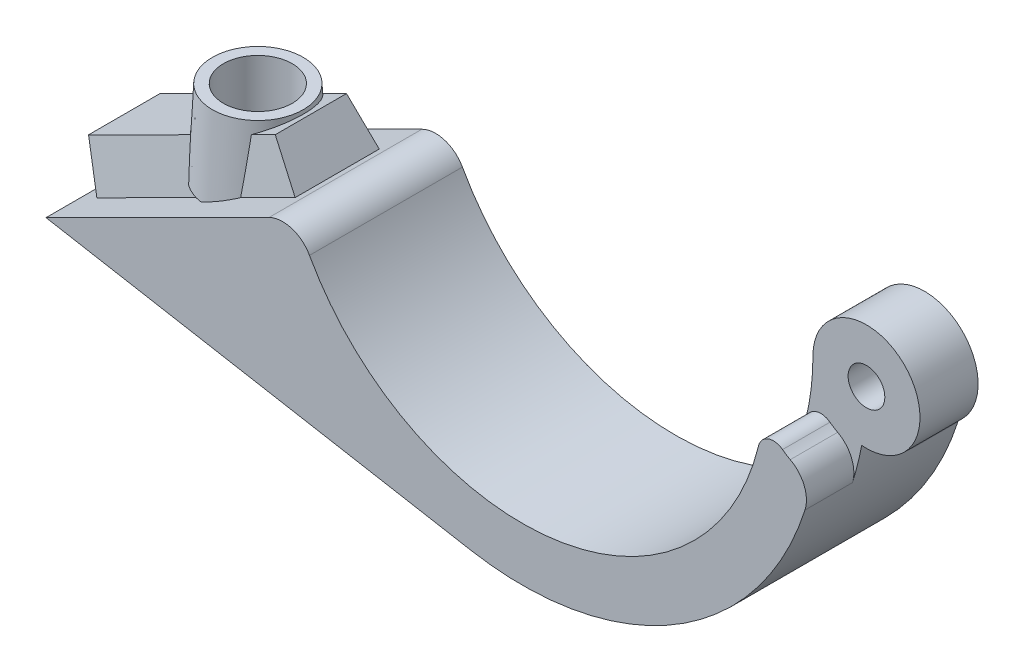
ISO-10303-21;
HEADER;
FILE_DESCRIPTION(('STEP AP214'),'2;1');
FILE_NAME('part.step','',(''),(''),'','','');
FILE_SCHEMA(('AUTOMOTIVE_DESIGN { 1 0 10303 214 1 1 1 1 }'));
ENDSEC;
DATA;
#1=APPLICATION_CONTEXT('core data for automotive mechanical design processes');
#2=APPLICATION_PROTOCOL_DEFINITION('international standard','automotive_design',2000,#1);
#3=PRODUCT_CONTEXT('',#1,'mechanical');
#4=PRODUCT('Part','Part','',(#3));
#5=PRODUCT_RELATED_PRODUCT_CATEGORY('part','',(#4));
#6=PRODUCT_DEFINITION_FORMATION('','',#4);
#7=PRODUCT_DEFINITION_CONTEXT('part definition',#1,'design');
#8=PRODUCT_DEFINITION('design','',#6,#7);
#9=PRODUCT_DEFINITION_SHAPE('','',#8);
#10=(LENGTH_UNIT() NAMED_UNIT(*) SI_UNIT(.MILLI.,.METRE.));
#11=(NAMED_UNIT(*) PLANE_ANGLE_UNIT() SI_UNIT($,.RADIAN.));
#12=(NAMED_UNIT(*) SI_UNIT($,.STERADIAN.) SOLID_ANGLE_UNIT());
#13=UNCERTAINTY_MEASURE_WITH_UNIT(LENGTH_MEASURE(1.E-05),#10,'distance_accuracy_value','');
#14=(GEOMETRIC_REPRESENTATION_CONTEXT(3) GLOBAL_UNCERTAINTY_ASSIGNED_CONTEXT((#13)) GLOBAL_UNIT_ASSIGNED_CONTEXT((#10,
#11,#12)) REPRESENTATION_CONTEXT('',''));
#15=CARTESIAN_POINT('',(0.,0.,0.));
#16=DIRECTION('',(0.,0.,1.));
#17=DIRECTION('',(1.,0.,0.));
#18=AXIS2_PLACEMENT_3D('',#15,#16,#17);
#19=CARTESIAN_POINT('',(-32.8,-13.865042807226,10.));
#20=DIRECTION('',(0.175293950205598,0.984516140559065,0.));
#21=DIRECTION('',(-0.984516140559065,0.175293950205598,0.));
#22=AXIS2_PLACEMENT_3D('',#19,#20,#21);
#23=PLANE('',#22);
#24=DIRECTION('',(0.,0.,1.));
#25=VECTOR('',#24,1.);
#26=CARTESIAN_POINT('',(-31.152278781714,-14.1584209950401,10.));
#27=LINE('',#26,#25);
#28=CARTESIAN_POINT('',(-31.152278781714,-14.1584209950401,0.));
#29=VERTEX_POINT('',#28);
#30=CARTESIAN_POINT('',(-31.152278781714,-14.1584209950401,10.));
#31=VERTEX_POINT('',#30);
#32=EDGE_CURVE('E322',#29,#31,#27,.T.);
#33=ORIENTED_EDGE('',*,*,#32,.F.);
#34=DIRECTION('',(0.984516140559066,-0.175293950205598,0.));
#35=VECTOR('',#34,1.);
#36=CARTESIAN_POINT('',(-32.8,-13.865042807226,0.));
#37=LINE('',#36,#35);
#38=CARTESIAN_POINT('',(-3.4007026339886,-19.0996131268459,0.));
#39=VERTEX_POINT('',#38);
#40=EDGE_CURVE('E368',#29,#39,#37,.T.);
#41=ORIENTED_EDGE('',*,*,#40,.T.);
#42=DIRECTION('',(0.,0.,-1.));
#43=VECTOR('',#42,1.);
#44=CARTESIAN_POINT('',(-3.4007026339886,-19.0996131268459,10.));
#45=LINE('',#44,#43);
#46=CARTESIAN_POINT('',(-3.4007026339886,-19.0996131268459,10.));
#47=VERTEX_POINT('',#46);
#48=EDGE_CURVE('E374',#47,#39,#45,.T.);
#49=ORIENTED_EDGE('',*,*,#48,.F.);
#50=DIRECTION('',(0.984516140559066,-0.175293950205598,0.));
#51=VECTOR('',#50,1.);
#52=CARTESIAN_POINT('',(-32.8,-13.865042807226,10.));
#53=LINE('',#52,#51);
#54=EDGE_CURVE('E360',#31,#47,#53,.T.);
#55=ORIENTED_EDGE('',*,*,#54,.F.);
#56=EDGE_LOOP('',(#33,#41,#49,#55));
#57=FACE_BOUND('',#56,.T.);
#58=DIRECTION('',(-0.498030318468977,0.0886747288845909,0.862613815297978));
#59=VECTOR('',#58,1.);
#60=CARTESIAN_POINT('',(-24.72915805951,-15.3020631941443,14.8074251786868));
#61=LINE('',#60,#59);
#62=CARTESIAN_POINT('',(-19.0668384925381,-16.3102440896422,5.));
#63=VERTEX_POINT('',#62);
#64=CARTESIAN_POINT('',(-20.683419246269,-16.0224104884715,7.80000000000001));
#65=VERTEX_POINT('',#64);
#66=EDGE_CURVE('E11',#63,#65,#61,.T.);
#67=ORIENTED_EDGE('',*,*,#66,.F.);
#68=DIRECTION('',(0.498030318468978,-0.088674728884591,0.862613815297977));
#69=VECTOR('',#68,1.);
#70=CARTESIAN_POINT('',(-20.4330797280241,-16.0669836561808,2.6336007647425));
#71=LINE('',#70,#69);
#72=CARTESIAN_POINT('',(-20.6834192462691,-16.0224104884715,2.19999999999999));
#73=VERTEX_POINT('',#72);
#74=EDGE_CURVE('E41',#73,#63,#71,.T.);
#75=ORIENTED_EDGE('',*,*,#74,.F.);
#76=DIRECTION('',(0.984516140559065,-0.175293950205598,0.));
#77=VECTOR('',#76,1.);
#78=CARTESIAN_POINT('',(-32.8,-13.865042807226,2.19999999999999));
#79=LINE('',#78,#77);
#80=CARTESIAN_POINT('',(-23.916580753731,-15.44674328613,2.19999999999999));
#81=VERTEX_POINT('',#80);
#82=EDGE_CURVE('E444',#81,#73,#79,.T.);
#83=ORIENTED_EDGE('',*,*,#82,.F.);
#84=DIRECTION('',(0.498030318468977,-0.0886747288845909,-0.862613815297978));
#85=VECTOR('',#84,1.);
#86=CARTESIAN_POINT('',(-29.5407657907743,-14.4453522766634,11.9413742353277));
#87=LINE('',#86,#85);
#88=CARTESIAN_POINT('',(-25.5331615074619,-15.1589096849592,4.99999999999999));
#89=VERTEX_POINT('',#88);
#90=EDGE_CURVE('E442',#89,#81,#87,.T.);
#91=ORIENTED_EDGE('',*,*,#90,.F.);
#92=DIRECTION('',(-0.498030318468978,0.088674728884591,-0.862613815297977));
#93=VECTOR('',#92,1.);
#94=CARTESIAN_POINT('',(-25.2446874592884,-15.2102727386999,5.49965170810165));
#95=LINE('',#94,#93);
#96=CARTESIAN_POINT('',(-23.9165807537309,-15.44674328613,7.80000000000001));
#97=VERTEX_POINT('',#96);
#98=EDGE_CURVE('E440',#97,#89,#95,.T.);
#99=ORIENTED_EDGE('',*,*,#98,.F.);
#100=DIRECTION('',(-0.984516140559065,0.175293950205598,0.));
#101=VECTOR('',#100,1.);
#102=CARTESIAN_POINT('',(-32.8,-13.865042807226,7.80000000000001));
#103=LINE('',#102,#101);
#104=EDGE_CURVE('E437',#65,#97,#103,.T.);
#105=ORIENTED_EDGE('',*,*,#104,.F.);
#106=EDGE_LOOP('',(#67,#75,#83,#91,#99,#105));
#107=FACE_BOUND('',#106,.T.);
#108=ADVANCED_FACE('F33',(#57,#107),#23,.F.);
#109=CARTESIAN_POINT('',(-0.575799802144668,1.15007573002816,0.));
#110=DIRECTION('',(-0.447687460912666,0.894190101343987,0.));
#111=DIRECTION('',(-0.894190101343987,-0.447687460912666,0.));
#112=AXIS2_PLACEMENT_3D('',#109,#110,#111);
#113=PLANE('',#112);
#114=DIRECTION('',(0.894190101343987,0.447687460912666,0.));
#115=VECTOR('',#114,1.);
#116=CARTESIAN_POINT('',(-32.3523125390873,-14.75923290857,10.));
#117=LINE('',#116,#115);
#118=CARTESIAN_POINT('',(-16.5690700582178,-6.8571551058644,10.));
#119=VERTEX_POINT('',#118);
#120=EDGE_CURVE('E299',#31,#119,#117,.T.);
#121=ORIENTED_EDGE('',*,*,#120,.T.);
#122=DIRECTION('',(0.,0.,1.));
#123=VECTOR('',#122,1.);
#124=CARTESIAN_POINT('',(-16.5690700582178,-6.8571551058644,0.));
#125=LINE('',#124,#123);
#126=CARTESIAN_POINT('',(-16.5690700582178,-6.8571551058644,0.));
#127=VERTEX_POINT('',#126);
#128=EDGE_CURVE('E408',#119,#127,#125,.F.);
#129=ORIENTED_EDGE('',*,*,#128,.T.);
#130=DIRECTION('',(-0.894190101343987,-0.447687460912666,0.));
#131=VECTOR('',#130,1.);
#132=CARTESIAN_POINT('',(-0.575799802144668,1.15007573002816,0.));
#133=LINE('',#132,#131);
#134=EDGE_CURVE('E377',#127,#29,#133,.T.);
#135=ORIENTED_EDGE('',*,*,#134,.T.);
#136=ORIENTED_EDGE('',*,*,#32,.T.);
#137=EDGE_LOOP('',(#121,#129,#135,#136));
#138=FACE_BOUND('',#137,.T.);
#139=DIRECTION('',(0.894190101343987,0.447687460912666,0.));
#140=VECTOR('',#139,1.);
#141=CARTESIAN_POINT('',(-30.0763550695001,-13.6197463282855,7.75));
#142=LINE('',#141,#140);
#143=CARTESIAN_POINT('',(-20.6772605160455,-8.9139720536769,7.75));
#144=VERTEX_POINT('',#143);
#145=CARTESIAN_POINT('',(-17.1105986000123,-7.12827814505184,7.75));
#146=VERTEX_POINT('',#145);
#147=EDGE_CURVE('E285',#144,#146,#142,.T.);
#148=ORIENTED_EDGE('',*,*,#147,.F.);
#149=CARTESIAN_POINT('',(-22.3849577678789,-9.76895204678102,5.));
#150=DIRECTION('',(-0.447687460912666,0.894190101343987,0.));
#151=DIRECTION('',(-0.894190101343987,-0.447687460912666,0.));
#152=AXIS2_PLACEMENT_3D('',#149,#150,#151);
#153=ELLIPSE('',#152,3.62103235653949,3.23677651107604);
#154=CARTESIAN_POINT('',(-22.8464421978494,-10.,8.20373234281667));
#155=VERTEX_POINT('',#154);
#156=EDGE_CURVE('E272',#144,#155,#153,.F.);
#157=ORIENTED_EDGE('',*,*,#156,.T.);
#158=DIRECTION('',(0.,0.,-1.));
#159=VECTOR('',#158,1.);
#160=CARTESIAN_POINT('',(-22.8464421978494,-10.,0.));
#161=LINE('',#160,#159);
#162=CARTESIAN_POINT('',(-22.8464421978494,-10.,7.75));
#163=VERTEX_POINT('',#162);
#164=EDGE_CURVE('E280',#155,#163,#161,.T.);
#165=ORIENTED_EDGE('',*,*,#164,.T.);
#166=CARTESIAN_POINT('',(-30.0763550695001,-13.6197463282855,7.75));
#167=VERTEX_POINT('',#166);
#168=EDGE_CURVE('E286',#167,#163,#142,.T.);
#169=ORIENTED_EDGE('',*,*,#168,.F.);
#170=DIRECTION('',(0.,0.,1.));
#171=VECTOR('',#170,1.);
#172=CARTESIAN_POINT('',(-30.0763550695001,-13.6197463282855,2.25));
#173=LINE('',#172,#171);
#174=CARTESIAN_POINT('',(-30.0763550695001,-13.6197463282855,2.25));
#175=VERTEX_POINT('',#174);
#176=EDGE_CURVE('E282',#175,#167,#173,.T.);
#177=ORIENTED_EDGE('',*,*,#176,.F.);
#178=DIRECTION('',(-0.894190101343987,-0.447687460912666,0.));
#179=VECTOR('',#178,1.);
#180=CARTESIAN_POINT('',(-30.0763550695001,-13.6197463282855,2.25));
#181=LINE('',#180,#179);
#182=CARTESIAN_POINT('',(-22.8464421978494,-10.,2.25));
#183=VERTEX_POINT('',#182);
#184=EDGE_CURVE('E292',#183,#175,#181,.T.);
#185=ORIENTED_EDGE('',*,*,#184,.F.);
#186=CARTESIAN_POINT('',(-22.8464421978494,-10.,1.79626765718333));
#187=VERTEX_POINT('',#186);
#188=EDGE_CURVE('E276',#183,#187,#161,.T.);
#189=ORIENTED_EDGE('',*,*,#188,.T.);
#190=CARTESIAN_POINT('',(-20.6772605160454,-8.91397205367689,2.25));
#191=VERTEX_POINT('',#190);
#192=EDGE_CURVE('E275',#187,#191,#153,.F.);
#193=ORIENTED_EDGE('',*,*,#192,.T.);
#194=CARTESIAN_POINT('',(-17.1105986000123,-7.12827814505184,2.25));
#195=VERTEX_POINT('',#194);
#196=EDGE_CURVE('E293',#195,#191,#181,.T.);
#197=ORIENTED_EDGE('',*,*,#196,.F.);
#198=DIRECTION('',(0.,0.,-1.));
#199=VECTOR('',#198,1.);
#200=CARTESIAN_POINT('',(-17.1105986000123,-7.12827814505184,2.25));
#201=LINE('',#200,#199);
#202=EDGE_CURVE('E289',#146,#195,#201,.T.);
#203=ORIENTED_EDGE('',*,*,#202,.F.);
#204=EDGE_LOOP('',(#148,#157,#165,#169,#177,#185,#189,#193,#197,#203));
#205=FACE_BOUND('',#204,.T.);
#206=ADVANCED_FACE('F485',(#138,#205),#113,.T.);
#207=CARTESIAN_POINT('',(-30.0763550695001,-13.6197463282855,7.75));
#208=DIRECTION('',(-0.0623060521961539,0.124447209251838,0.99026806874157));
#209=DIRECTION('',(0.,-0.992195815435928,0.12468946960924));
#210=AXIS2_PLACEMENT_3D('',#207,#208,#209);
#211=PLANE('',#210);
#212=CARTESIAN_POINT('',(-22.3664020046807,3.72509544041,6.0553675384334));
#213=DIRECTION('',(-0.0623060521961539,0.124447209251838,0.99026806874157));
#214=DIRECTION('',(-0.00781456292776182,-0.992226230307095,0.124201612295569));
#215=AXIS2_PLACEMENT_3D('',#212,#213,#214);
#216=ELLIPSE('',#215,20.3355161014419,2.29917890808214);
#217=CARTESIAN_POINT('',(-20.3927759697885,-5.4165500183824,7.32837749589283));
#218=VERTEX_POINT('',#217);
#219=EDGE_CURVE('E271',#144,#218,#216,.T.);
#220=ORIENTED_EDGE('',*,*,#219,.F.);
#221=ORIENTED_EDGE('',*,*,#147,.T.);
#222=DIRECTION('',(0.562357730083639,-0.815323657757394,0.137844537491629));
#223=VECTOR('',#222,1.);
#224=CARTESIAN_POINT('',(-17.5369472766575,-6.51014462624931,7.64549385916045));
#225=LINE('',#224,#223);
#226=CARTESIAN_POINT('',(-18.8306716524268,-4.63446294934726,7.32837749589283));
#227=VERTEX_POINT('',#226);
#228=EDGE_CURVE('E300',#227,#146,#225,.T.);
#229=ORIENTED_EDGE('',*,*,#228,.F.);
#230=DIRECTION('',(-0.894190101343987,-0.447687460912666,0.));
#231=VECTOR('',#230,1.);
#232=CARTESIAN_POINT('',(-31.4194174522381,-10.9371760242535,7.32837749589283));
#233=LINE('',#232,#231);
#234=EDGE_CURVE('E311',#218,#227,#233,.F.);
#235=ORIENTED_EDGE('',*,*,#234,.F.);
#236=EDGE_LOOP('',(#220,#221,#229,#235));
#237=FACE_BOUND('',#236,.T.);
#238=ADVANCED_FACE('F491',(#237),#211,.T.);
#239=CARTESIAN_POINT('',(-24.3679062631469,-7.40674873021766,7.32837749589283));
#240=VERTEX_POINT('',#239);
#241=CARTESIAN_POINT('',(-24.1564882875183,-10.,7.66757403614356));
#242=VERTEX_POINT('',#241);
#243=EDGE_CURVE('E268',#240,#242,#216,.T.);
#244=ORIENTED_EDGE('',*,*,#243,.F.);
#245=CARTESIAN_POINT('',(-31.0424067825616,-10.7484209159262,7.32837749589283));
#246=VERTEX_POINT('',#245);
#247=EDGE_CURVE('E312',#246,#240,#233,.F.);
#248=ORIENTED_EDGE('',*,*,#247,.F.);
#249=DIRECTION('',(0.31583928818493,-0.93874619973801,0.137844537491629));
#250=VECTOR('',#249,1.);
#251=CARTESIAN_POINT('',(-30.0763550695001,-13.6197463282855,7.75));
#252=LINE('',#251,#250);
#253=EDGE_CURVE('E297',#246,#167,#252,.T.);
#254=ORIENTED_EDGE('',*,*,#253,.T.);
#255=ORIENTED_EDGE('',*,*,#168,.T.);
#256=DIRECTION('',(-0.998026496875698,0.,-0.0627941998437897));
#257=VECTOR('',#256,1.);
#258=CARTESIAN_POINT('',(-30.047846716666,-10.,7.29689936998049));
#259=LINE('',#258,#257);
#260=EDGE_CURVE('E279',#242,#163,#259,.F.);
#261=ORIENTED_EDGE('',*,*,#260,.F.);
#262=EDGE_LOOP('',(#244,#248,#254,#255,#261));
#263=FACE_BOUND('',#262,.T.);
#264=ADVANCED_FACE('F736',(#263),#211,.T.);
#265=CARTESIAN_POINT('',(-30.0763550695001,-13.6197463282855,2.25));
#266=DIRECTION('',(-0.0623060521961539,0.124447209251838,-0.99026806874157));
#267=DIRECTION('',(0.,0.992195815435928,0.12468946960924));
#268=AXIS2_PLACEMENT_3D('',#265,#266,#267);
#269=PLANE('',#268);
#270=CARTESIAN_POINT('',(-22.3664020046807,3.72509544041047,3.94463246156666));
#271=DIRECTION('',(-0.0623060521961539,0.124447209251838,-0.99026806874157));
#272=DIRECTION('',(-0.00781456292776182,-0.992226230307096,-0.124201612295569));
#273=AXIS2_PLACEMENT_3D('',#270,#271,#272);
#274=ELLIPSE('',#273,20.3355161014426,2.29917890808218);
#275=CARTESIAN_POINT('',(-20.3927759697885,-5.4165500183824,2.67162250410717));
#276=VERTEX_POINT('',#275);
#277=EDGE_CURVE('E269',#276,#191,#274,.T.);
#278=ORIENTED_EDGE('',*,*,#277,.F.);
#279=DIRECTION('',(0.894190101343987,0.447687460912666,0.));
#280=VECTOR('',#279,1.);
#281=CARTESIAN_POINT('',(-31.4194174522381,-10.9371760242535,2.67162250410717));
#282=LINE('',#281,#280);
#283=CARTESIAN_POINT('',(-18.8306716524268,-4.63446294934726,2.67162250410717));
#284=VERTEX_POINT('',#283);
#285=EDGE_CURVE('E305',#284,#276,#282,.F.);
#286=ORIENTED_EDGE('',*,*,#285,.F.);
#287=DIRECTION('',(0.562357730083639,-0.815323657757394,-0.137844537491629));
#288=VECTOR('',#287,1.);
#289=CARTESIAN_POINT('',(-18.2346087475315,-5.49865341366335,2.52551618948607));
#290=LINE('',#289,#288);
#291=EDGE_CURVE('E304',#284,#195,#290,.T.);
#292=ORIENTED_EDGE('',*,*,#291,.T.);
#293=ORIENTED_EDGE('',*,*,#196,.T.);
#294=EDGE_LOOP('',(#278,#286,#292,#293));
#295=FACE_BOUND('',#294,.T.);
#296=ADVANCED_FACE('F732',(#295),#269,.T.);
#297=CARTESIAN_POINT('',(-24.1564882875183,-10.,2.33242596385644));
#298=VERTEX_POINT('',#297);
#299=CARTESIAN_POINT('',(-24.3679062631469,-7.40674873021766,2.67162250410717));
#300=VERTEX_POINT('',#299);
#301=EDGE_CURVE('E266',#298,#300,#274,.T.);
#302=ORIENTED_EDGE('',*,*,#301,.F.);
#303=DIRECTION('',(0.998026496875698,0.,-0.0627941998437897));
#304=VECTOR('',#303,1.);
#305=CARTESIAN_POINT('',(-30.047846716666,-10.,2.70310063001951));
#306=LINE('',#305,#304);
#307=EDGE_CURVE('E383',#183,#298,#306,.F.);
#308=ORIENTED_EDGE('',*,*,#307,.F.);
#309=ORIENTED_EDGE('',*,*,#184,.T.);
#310=DIRECTION('',(0.315839288184931,-0.93874619973801,-0.137844537491629));
#311=VECTOR('',#310,1.);
#312=CARTESIAN_POINT('',(-30.0763550695001,-13.6197463282855,2.25));
#313=LINE('',#312,#311);
#314=CARTESIAN_POINT('',(-31.0424067825616,-10.7484209159262,2.67162250410717));
#315=VERTEX_POINT('',#314);
#316=EDGE_CURVE('E301',#315,#175,#313,.T.);
#317=ORIENTED_EDGE('',*,*,#316,.F.);
#318=EDGE_CURVE('E317',#300,#315,#282,.F.);
#319=ORIENTED_EDGE('',*,*,#318,.F.);
#320=EDGE_LOOP('',(#302,#308,#309,#317,#319));
#321=FACE_BOUND('',#320,.T.);
#322=ADVANCED_FACE('F735',(#321),#269,.T.);
#323=CARTESIAN_POINT('',(-1.91886218488267,3.83264603406012,0.));
#324=DIRECTION('',(-0.447687460912666,0.894190101343987,0.));
#325=DIRECTION('',(-0.894190101343987,-0.447687460912666,0.));
#326=AXIS2_PLACEMENT_3D('',#323,#324,#325);
#327=PLANE('',#326);
#328=ORIENTED_EDGE('',*,*,#285,.T.);
#329=CARTESIAN_POINT('',(-22.3803411164677,-6.41164937430003,5.));
#330=DIRECTION('',(-0.447687460912666,0.894190101343987,0.));
#331=DIRECTION('',(-0.894190101343987,-0.447687460912666,0.));
#332=AXIS2_PLACEMENT_3D('',#329,#330,#331);
#333=ELLIPSE('',#332,3.42426348470643,3.06088831131721);
#334=EDGE_CURVE('E382',#276,#218,#333,.F.);
#335=ORIENTED_EDGE('',*,*,#334,.T.);
#336=ORIENTED_EDGE('',*,*,#234,.T.);
#337=DIRECTION('',(0.,0.,1.));
#338=VECTOR('',#337,1.);
#339=CARTESIAN_POINT('',(-18.8306716524268,-4.63446294934726,2.25));
#340=LINE('',#339,#338);
#341=EDGE_CURVE('E315',#227,#284,#340,.F.);
#342=ORIENTED_EDGE('',*,*,#341,.T.);
#343=EDGE_LOOP('',(#328,#335,#336,#342));
#344=FACE_BOUND('',#343,.T.);
#345=ADVANCED_FACE('F503',(#344),#327,.T.);
#346=CARTESIAN_POINT('',(0.,0.,10.));
#347=DIRECTION('',(0.,0.,-1.));
#348=DIRECTION('',(-1.,0.,0.));
#349=AXIS2_PLACEMENT_3D('',#346,#347,#348);
#350=CYLINDRICAL_SURFACE('',#349,15.9);
#351=CARTESIAN_POINT('',(0.,0.,3.1));
#352=DIRECTION('',(0.,0.,-1.));
#353=DIRECTION('',(-1.,0.,0.));
#354=AXIS2_PLACEMENT_3D('',#351,#352,#353);
#355=CIRCLE('',#354,15.9);
#356=CARTESIAN_POINT('',(15.4453470993717,-3.77508317523346,3.1));
#357=VERTEX_POINT('',#356);
#358=CARTESIAN_POINT('',(15.9,0.,3.1));
#359=VERTEX_POINT('',#358);
#360=EDGE_CURVE('E338',#357,#359,#355,.F.);
#361=ORIENTED_EDGE('',*,*,#360,.F.);
#362=DIRECTION('',(0.,0.,-1.));
#363=VECTOR('',#362,1.);
#364=CARTESIAN_POINT('',(15.4453470993717,-3.77508317523346,10.));
#365=LINE('',#364,#363);
#366=CARTESIAN_POINT('',(15.4453470993717,-3.77508317523346,0.));
#367=VERTEX_POINT('',#366);
#368=EDGE_CURVE('E425',#357,#367,#365,.T.);
#369=ORIENTED_EDGE('',*,*,#368,.T.);
#370=CARTESIAN_POINT('',(0.,0.,0.));
#371=DIRECTION('',(0.,0.,-1.));
#372=DIRECTION('',(1.,0.,0.));
#373=AXIS2_PLACEMENT_3D('',#370,#371,#372);
#374=CIRCLE('',#373,15.9);
#375=CARTESIAN_POINT('',(-13.9224442831643,-7.67955370983144,0.));
#376=VERTEX_POINT('',#375);
#377=EDGE_CURVE('E357',#367,#376,#374,.T.);
#378=ORIENTED_EDGE('',*,*,#377,.T.);
#379=DIRECTION('',(0.,0.,-1.));
#380=VECTOR('',#379,1.);
#381=CARTESIAN_POINT('',(-13.9224442831643,-7.67955370983144,10.));
#382=LINE('',#381,#380);
#383=CARTESIAN_POINT('',(-13.9224442831643,-7.67955370983144,10.));
#384=VERTEX_POINT('',#383);
#385=EDGE_CURVE('E411',#376,#384,#382,.F.);
#386=ORIENTED_EDGE('',*,*,#385,.T.);
#387=CARTESIAN_POINT('',(0.,0.,10.));
#388=DIRECTION('',(0.,0.,-1.));
#389=DIRECTION('',(1.,0.,0.));
#390=AXIS2_PLACEMENT_3D('',#387,#388,#389);
#391=CIRCLE('',#390,15.9);
#392=CARTESIAN_POINT('',(15.4453470993717,-3.77508317523346,10.));
#393=VERTEX_POINT('',#392);
#394=EDGE_CURVE('E358',#393,#384,#391,.T.);
#395=ORIENTED_EDGE('',*,*,#394,.F.);
#396=DIRECTION('',(0.,0.,-1.));
#397=VECTOR('',#396,1.);
#398=CARTESIAN_POINT('',(15.4453470993717,-3.77508317523346,10.));
#399=LINE('',#398,#397);
#400=CARTESIAN_POINT('',(15.4453470993717,-3.77508317523346,6.9));
#401=VERTEX_POINT('',#400);
#402=EDGE_CURVE('E422',#393,#401,#399,.T.);
#403=ORIENTED_EDGE('',*,*,#402,.T.);
#404=CARTESIAN_POINT('',(0.,0.,6.9));
#405=DIRECTION('',(0.,0.,1.));
#406=DIRECTION('',(1.,0.,0.));
#407=AXIS2_PLACEMENT_3D('',#404,#405,#406);
#408=CIRCLE('',#407,15.9);
#409=CARTESIAN_POINT('',(15.9,0.,6.9));
#410=VERTEX_POINT('',#409);
#411=EDGE_CURVE('E346',#410,#401,#408,.F.);
#412=ORIENTED_EDGE('',*,*,#411,.F.);
#413=DIRECTION('',(0.,0.,-1.));
#414=VECTOR('',#413,1.);
#415=CARTESIAN_POINT('',(15.9,0.,10.));
#416=LINE('',#415,#414);
#417=EDGE_CURVE('E366',#410,#359,#416,.T.);
#418=ORIENTED_EDGE('',*,*,#417,.T.);
#419=EDGE_LOOP('',(#361,#369,#378,#386,#395,#403,#412,#418));
#420=FACE_BOUND('',#419,.T.);
#421=ADVANCED_FACE('F499',(#420),#350,.F.);
#422=CARTESIAN_POINT('',(0.,0.,10.));
#423=DIRECTION('',(0.,0.,1.));
#424=DIRECTION('',(1.,0.,0.));
#425=AXIS2_PLACEMENT_3D('',#422,#423,#424);
#426=PLANE('',#425);
#427=CARTESIAN_POINT('',(19.4,0.,10.));
#428=DIRECTION('',(0.,0.,1.));
#429=DIRECTION('',(1.,0.,0.));
#430=AXIS2_PLACEMENT_3D('',#427,#428,#429);
#431=CIRCLE('',#430,4.);
#432=CARTESIAN_POINT('',(17.0134020618557,-3.21000783202242,10.));
#433=VERTEX_POINT('',#432);
#434=CARTESIAN_POINT('',(17.5168384879725,-3.52898040793914,10.));
#435=VERTEX_POINT('',#434);
#436=EDGE_CURVE('E341',#433,#435,#431,.T.);
#437=ORIENTED_EDGE('',*,*,#436,.F.);
#438=CARTESIAN_POINT('',(16.4167525773196,-4.01250979002802,10.));
#439=DIRECTION('',(0.,0.,1.));
#440=DIRECTION('',(1.,0.,0.));
#441=AXIS2_PLACEMENT_3D('',#438,#439,#440);
#442=CIRCLE('',#441,1.);
#443=EDGE_CURVE('E432',#433,#393,#442,.T.);
#444=ORIENTED_EDGE('',*,*,#443,.T.);
#445=ORIENTED_EDGE('',*,*,#394,.T.);
#446=CARTESIAN_POINT('',(-15.6736951363925,-8.64553530855237,10.));
#447=DIRECTION('',(0.,0.,1.));
#448=DIRECTION('',(1.,0.,0.));
#449=AXIS2_PLACEMENT_3D('',#446,#447,#448);
#450=CIRCLE('',#449,2.);
#451=EDGE_CURVE('E403',#384,#119,#450,.T.);
#452=ORIENTED_EDGE('',*,*,#451,.T.);
#453=ORIENTED_EDGE('',*,*,#120,.F.);
#454=ORIENTED_EDGE('',*,*,#54,.T.);
#455=CARTESIAN_POINT('',(0.,0.,10.));
#456=DIRECTION('',(0.,0.,1.));
#457=DIRECTION('',(1.,0.,0.));
#458=AXIS2_PLACEMENT_3D('',#455,#456,#457);
#459=CIRCLE('',#458,19.4);
#460=CARTESIAN_POINT('',(18.4804597701149,-5.90191550982926,10.));
#461=VERTEX_POINT('',#460);
#462=EDGE_CURVE('E363',#47,#461,#459,.T.);
#463=ORIENTED_EDGE('',*,*,#462,.T.);
#464=CARTESIAN_POINT('',(16.5752577319588,-5.29347061190872,10.));
#465=DIRECTION('',(0.,0.,1.));
#466=DIRECTION('',(1.,0.,0.));
#467=AXIS2_PLACEMENT_3D('',#464,#465,#466);
#468=CIRCLE('',#467,2.);
#469=EDGE_CURVE('E405',#461,#435,#468,.T.);
#470=ORIENTED_EDGE('',*,*,#469,.T.);
#471=EDGE_LOOP('',(#437,#444,#445,#452,#453,#454,#463,#470));
#472=FACE_BOUND('',#471,.T.);
#473=ADVANCED_FACE('F502',(#472),#426,.T.);
#474=CARTESIAN_POINT('',(0.,0.,0.));
#475=DIRECTION('',(0.,0.,1.));
#476=DIRECTION('',(1.,0.,0.));
#477=AXIS2_PLACEMENT_3D('',#474,#475,#476);
#478=PLANE('',#477);
#479=ORIENTED_EDGE('',*,*,#377,.F.);
#480=CARTESIAN_POINT('',(16.4167525773196,-4.01250979002802,0.));
#481=DIRECTION('',(0.,0.,1.));
#482=DIRECTION('',(1.,0.,0.));
#483=AXIS2_PLACEMENT_3D('',#480,#481,#482);
#484=CIRCLE('',#483,1.);
#485=CARTESIAN_POINT('',(17.0134020618557,-3.21000783202241,0.));
#486=VERTEX_POINT('',#485);
#487=EDGE_CURVE('E427',#367,#486,#484,.F.);
#488=ORIENTED_EDGE('',*,*,#487,.T.);
#489=CARTESIAN_POINT('',(19.4,0.,0.));
#490=DIRECTION('',(0.,0.,-1.));
#491=DIRECTION('',(-1.,0.,0.));
#492=AXIS2_PLACEMENT_3D('',#489,#490,#491);
#493=CIRCLE('',#492,4.);
#494=CARTESIAN_POINT('',(17.5168384879725,-3.52898040793914,0.));
#495=VERTEX_POINT('',#494);
#496=EDGE_CURVE('E331',#495,#486,#493,.T.);
#497=ORIENTED_EDGE('',*,*,#496,.F.);
#498=CARTESIAN_POINT('',(16.5752577319588,-5.29347061190872,0.));
#499=DIRECTION('',(0.,0.,1.));
#500=DIRECTION('',(1.,0.,0.));
#501=AXIS2_PLACEMENT_3D('',#498,#499,#500);
#502=CIRCLE('',#501,2.);
#503=CARTESIAN_POINT('',(18.4804597701149,-5.90191550982926,0.));
#504=VERTEX_POINT('',#503);
#505=EDGE_CURVE('E393',#495,#504,#502,.F.);
#506=ORIENTED_EDGE('',*,*,#505,.T.);
#507=CARTESIAN_POINT('',(0.,0.,0.));
#508=DIRECTION('',(0.,0.,1.));
#509=DIRECTION('',(1.,0.,0.));
#510=AXIS2_PLACEMENT_3D('',#507,#508,#509);
#511=CIRCLE('',#510,19.4);
#512=EDGE_CURVE('E361',#39,#504,#511,.T.);
#513=ORIENTED_EDGE('',*,*,#512,.F.);
#514=ORIENTED_EDGE('',*,*,#40,.F.);
#515=ORIENTED_EDGE('',*,*,#134,.F.);
#516=CARTESIAN_POINT('',(-15.6736951363925,-8.64553530855237,0.));
#517=DIRECTION('',(0.,0.,1.));
#518=DIRECTION('',(1.,0.,0.));
#519=AXIS2_PLACEMENT_3D('',#516,#517,#518);
#520=CIRCLE('',#519,2.);
#521=EDGE_CURVE('E390',#127,#376,#520,.F.);
#522=ORIENTED_EDGE('',*,*,#521,.T.);
#523=EDGE_LOOP('',(#479,#488,#497,#506,#513,#514,#515,#522));
#524=FACE_BOUND('',#523,.T.);
#525=ADVANCED_FACE('F530',(#524),#478,.F.);
#526=CARTESIAN_POINT('',(0.,0.,10.));
#527=DIRECTION('',(0.,0.,-1.));
#528=DIRECTION('',(-1.,0.,0.));
#529=AXIS2_PLACEMENT_3D('',#526,#527,#528);
#530=CYLINDRICAL_SURFACE('',#529,19.4);
#531=ORIENTED_EDGE('',*,*,#512,.T.);
#532=DIRECTION('',(0.,0.,-1.));
#533=VECTOR('',#532,1.);
#534=CARTESIAN_POINT('',(18.4804597701149,-5.90191550982926,10.));
#535=LINE('',#534,#533);
#536=CARTESIAN_POINT('',(18.4804597701149,-5.90191550982926,3.1));
#537=VERTEX_POINT('',#536);
#538=EDGE_CURVE('E397',#504,#537,#535,.F.);
#539=ORIENTED_EDGE('',*,*,#538,.T.);
#540=CARTESIAN_POINT('',(0.,0.,3.1));
#541=DIRECTION('',(0.,0.,-1.));
#542=DIRECTION('',(-1.,0.,0.));
#543=AXIS2_PLACEMENT_3D('',#540,#541,#542);
#544=CIRCLE('',#543,19.4);
#545=CARTESIAN_POINT('',(19.0842783505155,-3.48573089036529,3.1));
#546=VERTEX_POINT('',#545);
#547=EDGE_CURVE('E334',#546,#537,#544,.T.);
#548=ORIENTED_EDGE('',*,*,#547,.F.);
#549=DIRECTION('',(0.,0.,1.));
#550=VECTOR('',#549,1.);
#551=CARTESIAN_POINT('',(19.0842783505155,-3.48573089036529,5.));
#552=LINE('',#551,#550);
#553=CARTESIAN_POINT('',(19.0842783505155,-3.48573089036529,6.9));
#554=VERTEX_POINT('',#553);
#555=EDGE_CURVE('E354',#546,#554,#552,.T.);
#556=ORIENTED_EDGE('',*,*,#555,.T.);
#557=CARTESIAN_POINT('',(0.,0.,6.9));
#558=DIRECTION('',(0.,0.,1.));
#559=DIRECTION('',(1.,0.,0.));
#560=AXIS2_PLACEMENT_3D('',#557,#558,#559);
#561=CIRCLE('',#560,19.4);
#562=CARTESIAN_POINT('',(18.4804597701149,-5.90191550982926,6.9));
#563=VERTEX_POINT('',#562);
#564=EDGE_CURVE('E343',#563,#554,#561,.T.);
#565=ORIENTED_EDGE('',*,*,#564,.F.);
#566=DIRECTION('',(0.,0.,-1.));
#567=VECTOR('',#566,1.);
#568=CARTESIAN_POINT('',(18.4804597701149,-5.90191550982926,10.));
#569=LINE('',#568,#567);
#570=EDGE_CURVE('E395',#563,#461,#569,.F.);
#571=ORIENTED_EDGE('',*,*,#570,.T.);
#572=ORIENTED_EDGE('',*,*,#462,.F.);
#573=ORIENTED_EDGE('',*,*,#48,.T.);
#574=EDGE_LOOP('',(#531,#539,#548,#556,#565,#571,#572,#573));
#575=FACE_BOUND('',#574,.T.);
#576=ADVANCED_FACE('F497',(#575),#530,.T.);
#577=CARTESIAN_POINT('',(19.4,0.,3.1));
#578=DIRECTION('',(0.,0.,1.));
#579=DIRECTION('',(1.,0.,0.));
#580=AXIS2_PLACEMENT_3D('',#577,#578,#579);
#581=CYLINDRICAL_SURFACE('',#580,3.5);
#582=ORIENTED_EDGE('',*,*,#555,.F.);
#583=CARTESIAN_POINT('',(19.4,0.,3.1));
#584=DIRECTION('',(0.,0.,1.));
#585=DIRECTION('',(1.,0.,0.));
#586=AXIS2_PLACEMENT_3D('',#583,#584,#585);
#587=CIRCLE('',#586,3.5);
#588=EDGE_CURVE('E351',#546,#359,#587,.T.);
#589=ORIENTED_EDGE('',*,*,#588,.T.);
#590=ORIENTED_EDGE('',*,*,#417,.F.);
#591=CARTESIAN_POINT('',(19.4,0.,6.9));
#592=DIRECTION('',(0.,0.,1.));
#593=DIRECTION('',(1.,0.,0.));
#594=AXIS2_PLACEMENT_3D('',#591,#592,#593);
#595=CIRCLE('',#594,3.5);
#596=EDGE_CURVE('E348',#554,#410,#595,.T.);
#597=ORIENTED_EDGE('',*,*,#596,.F.);
#598=EDGE_LOOP('',(#582,#589,#590,#597));
#599=FACE_BOUND('',#598,.T.);
#600=ADVANCED_FACE('F558',(#599),#581,.T.);
#601=CARTESIAN_POINT('',(19.4,0.,3.1));
#602=DIRECTION('',(0.,0.,1.));
#603=DIRECTION('',(1.,0.,0.));
#604=AXIS2_PLACEMENT_3D('',#601,#602,#603);
#605=PLANE('',#604);
#606=CARTESIAN_POINT('',(19.4,0.,3.1));
#607=DIRECTION('',(0.,0.,-1.));
#608=DIRECTION('',(-1.,0.,0.));
#609=AXIS2_PLACEMENT_3D('',#606,#607,#608);
#610=CIRCLE('',#609,1.2);
#611=CARTESIAN_POINT('',(18.2,0.,3.1));
#612=VERTEX_POINT('',#611);
#613=EDGE_CURVE('E324',#612,#612,#610,.T.);
#614=ORIENTED_EDGE('',*,*,#613,.F.);
#615=EDGE_LOOP('',(#614));
#616=FACE_BOUND('',#615,.T.);
#617=ORIENTED_EDGE('',*,*,#588,.F.);
#618=ORIENTED_EDGE('',*,*,#547,.T.);
#619=CARTESIAN_POINT('',(16.5752577319588,-5.29347061190872,3.1));
#620=DIRECTION('',(0.,0.,1.));
#621=DIRECTION('',(1.,0.,0.));
#622=AXIS2_PLACEMENT_3D('',#619,#620,#621);
#623=CIRCLE('',#622,2.);
#624=CARTESIAN_POINT('',(17.5168384879725,-3.52898040793914,3.1));
#625=VERTEX_POINT('',#624);
#626=EDGE_CURVE('E414',#537,#625,#623,.T.);
#627=ORIENTED_EDGE('',*,*,#626,.T.);
#628=CARTESIAN_POINT('',(19.4,0.,3.1));
#629=DIRECTION('',(0.,0.,-1.));
#630=DIRECTION('',(-1.,0.,0.));
#631=AXIS2_PLACEMENT_3D('',#628,#629,#630);
#632=CIRCLE('',#631,4.);
#633=CARTESIAN_POINT('',(17.0134020618557,-3.21000783202241,3.1));
#634=VERTEX_POINT('',#633);
#635=EDGE_CURVE('E330',#625,#634,#632,.T.);
#636=ORIENTED_EDGE('',*,*,#635,.T.);
#637=CARTESIAN_POINT('',(16.4167525773196,-4.01250979002802,3.1));
#638=DIRECTION('',(0.,0.,1.));
#639=DIRECTION('',(1.,0.,0.));
#640=AXIS2_PLACEMENT_3D('',#637,#638,#639);
#641=CIRCLE('',#640,1.);
#642=EDGE_CURVE('E434',#634,#357,#641,.T.);
#643=ORIENTED_EDGE('',*,*,#642,.T.);
#644=ORIENTED_EDGE('',*,*,#360,.T.);
#645=EDGE_LOOP('',(#617,#618,#627,#636,#643,#644));
#646=FACE_BOUND('',#645,.T.);
#647=ADVANCED_FACE('F554',(#616,#646),#605,.F.);
#648=CARTESIAN_POINT('',(19.4,0.,6.9));
#649=DIRECTION('',(0.,0.,1.));
#650=DIRECTION('',(1.,0.,0.));
#651=AXIS2_PLACEMENT_3D('',#648,#649,#650);
#652=PLANE('',#651);
#653=CARTESIAN_POINT('',(19.4,0.,6.9));
#654=DIRECTION('',(0.,0.,1.));
#655=DIRECTION('',(1.,0.,0.));
#656=AXIS2_PLACEMENT_3D('',#653,#654,#655);
#657=CIRCLE('',#656,1.2);
#658=CARTESIAN_POINT('',(20.6,0.,6.9));
#659=VERTEX_POINT('',#658);
#660=EDGE_CURVE('E327',#659,#659,#657,.F.);
#661=ORIENTED_EDGE('',*,*,#660,.T.);
#662=EDGE_LOOP('',(#661));
#663=FACE_BOUND('',#662,.T.);
#664=ORIENTED_EDGE('',*,*,#564,.T.);
#665=ORIENTED_EDGE('',*,*,#596,.T.);
#666=ORIENTED_EDGE('',*,*,#411,.T.);
#667=CARTESIAN_POINT('',(16.4167525773196,-4.01250979002802,6.9));
#668=DIRECTION('',(0.,0.,1.));
#669=DIRECTION('',(1.,0.,0.));
#670=AXIS2_PLACEMENT_3D('',#667,#668,#669);
#671=CIRCLE('',#670,1.);
#672=CARTESIAN_POINT('',(17.0134020618557,-3.21000783202242,6.9));
#673=VERTEX_POINT('',#672);
#674=EDGE_CURVE('E55',#401,#673,#671,.F.);
#675=ORIENTED_EDGE('',*,*,#674,.T.);
#676=CARTESIAN_POINT('',(19.4,0.,6.9));
#677=DIRECTION('',(0.,0.,1.));
#678=DIRECTION('',(1.,0.,0.));
#679=AXIS2_PLACEMENT_3D('',#676,#677,#678);
#680=CIRCLE('',#679,4.);
#681=CARTESIAN_POINT('',(17.5168384879725,-3.52898040793914,6.9));
#682=VERTEX_POINT('',#681);
#683=EDGE_CURVE('E340',#673,#682,#680,.T.);
#684=ORIENTED_EDGE('',*,*,#683,.T.);
#685=CARTESIAN_POINT('',(16.5752577319588,-5.29347061190872,6.9));
#686=DIRECTION('',(0.,0.,1.));
#687=DIRECTION('',(1.,0.,0.));
#688=AXIS2_PLACEMENT_3D('',#685,#686,#687);
#689=CIRCLE('',#688,2.);
#690=EDGE_CURVE('E416',#682,#563,#689,.F.);
#691=ORIENTED_EDGE('',*,*,#690,.T.);
#692=EDGE_LOOP('',(#664,#665,#666,#675,#684,#691));
#693=FACE_BOUND('',#692,.T.);
#694=ADVANCED_FACE('F559',(#663,#693),#652,.T.);
#695=CARTESIAN_POINT('',(19.4,0.,10.));
#696=DIRECTION('',(0.,0.,-1.));
#697=DIRECTION('',(-1.,0.,0.));
#698=AXIS2_PLACEMENT_3D('',#695,#696,#697);
#699=CYLINDRICAL_SURFACE('',#698,4.);
#700=ORIENTED_EDGE('',*,*,#683,.F.);
#701=DIRECTION('',(0.,0.,-1.));
#702=VECTOR('',#701,1.);
#703=CARTESIAN_POINT('',(17.0134020618557,-3.21000783202241,10.));
#704=LINE('',#703,#702);
#705=EDGE_CURVE('E429',#673,#433,#704,.F.);
#706=ORIENTED_EDGE('',*,*,#705,.T.);
#707=ORIENTED_EDGE('',*,*,#436,.T.);
#708=DIRECTION('',(0.,0.,-1.));
#709=VECTOR('',#708,1.);
#710=CARTESIAN_POINT('',(17.5168384879725,-3.52898040793914,10.));
#711=LINE('',#710,#709);
#712=EDGE_CURVE('E400',#435,#682,#711,.T.);
#713=ORIENTED_EDGE('',*,*,#712,.T.);
#714=EDGE_LOOP('',(#700,#706,#707,#713));
#715=FACE_BOUND('',#714,.T.);
#716=ADVANCED_FACE('F567',(#715),#699,.F.);
#717=CARTESIAN_POINT('',(19.4,0.,0.));
#718=DIRECTION('',(0.,0.,1.));
#719=DIRECTION('',(1.,0.,0.));
#720=AXIS2_PLACEMENT_3D('',#717,#718,#719);
#721=CYLINDRICAL_SURFACE('',#720,4.);
#722=ORIENTED_EDGE('',*,*,#496,.T.);
#723=DIRECTION('',(0.,0.,1.));
#724=VECTOR('',#723,1.);
#725=CARTESIAN_POINT('',(17.0134020618557,-3.21000783202242,0.));
#726=LINE('',#725,#724);
#727=EDGE_CURVE('E419',#486,#634,#726,.T.);
#728=ORIENTED_EDGE('',*,*,#727,.T.);
#729=ORIENTED_EDGE('',*,*,#635,.F.);
#730=DIRECTION('',(0.,0.,1.));
#731=VECTOR('',#730,1.);
#732=CARTESIAN_POINT('',(17.5168384879725,-3.52898040793914,0.));
#733=LINE('',#732,#731);
#734=EDGE_CURVE('E385',#625,#495,#733,.F.);
#735=ORIENTED_EDGE('',*,*,#734,.T.);
#736=EDGE_LOOP('',(#722,#728,#729,#735));
#737=FACE_BOUND('',#736,.T.);
#738=ADVANCED_FACE('F532',(#737),#721,.F.);
#739=CARTESIAN_POINT('',(19.4,0.,10.2941125496954));
#740=DIRECTION('',(0.,0.,-1.));
#741=DIRECTION('',(-1.,0.,0.));
#742=AXIS2_PLACEMENT_3D('',#739,#740,#741);
#743=CYLINDRICAL_SURFACE('',#742,1.2);
#744=ORIENTED_EDGE('',*,*,#613,.T.);
#745=EDGE_LOOP('',(#744));
#746=FACE_BOUND('',#745,.T.);
#747=ORIENTED_EDGE('',*,*,#660,.F.);
#748=EDGE_LOOP('',(#747));
#749=FACE_BOUND('',#748,.T.);
#750=ADVANCED_FACE('F575',(#746,#749),#743,.F.);
#751=CARTESIAN_POINT('',(-30.0763550695001,-13.6197463282855,2.25));
#752=DIRECTION('',(-0.947793956941893,-0.318883388065965,0.));
#753=DIRECTION('',(0.318883388065965,-0.947793956941893,0.));
#754=AXIS2_PLACEMENT_3D('',#751,#752,#753);
#755=PLANE('',#754);
#756=ORIENTED_EDGE('',*,*,#176,.T.);
#757=ORIENTED_EDGE('',*,*,#253,.F.);
#758=DIRECTION('',(0.,0.,-1.));
#759=VECTOR('',#758,1.);
#760=CARTESIAN_POINT('',(-31.0424067825616,-10.7484209159262,2.25));
#761=LINE('',#760,#759);
#762=EDGE_CURVE('E296',#315,#246,#761,.F.);
#763=ORIENTED_EDGE('',*,*,#762,.F.);
#764=ORIENTED_EDGE('',*,*,#316,.T.);
#765=EDGE_LOOP('',(#756,#757,#763,#764));
#766=FACE_BOUND('',#765,.T.);
#767=ADVANCED_FACE('F728',(#766),#755,.T.);
#768=CARTESIAN_POINT('',(-17.1105986000123,-7.12827814505184,2.25));
#769=DIRECTION('',(0.823181852549585,0.567777806569641,0.));
#770=DIRECTION('',(-0.567777806569641,0.823181852549585,0.));
#771=AXIS2_PLACEMENT_3D('',#768,#769,#770);
#772=PLANE('',#771);
#773=ORIENTED_EDGE('',*,*,#202,.T.);
#774=ORIENTED_EDGE('',*,*,#291,.F.);
#775=ORIENTED_EDGE('',*,*,#341,.F.);
#776=ORIENTED_EDGE('',*,*,#228,.T.);
#777=EDGE_LOOP('',(#773,#774,#775,#776));
#778=FACE_BOUND('',#777,.T.);
#779=ADVANCED_FACE('F726',(#778),#772,.T.);
#780=ORIENTED_EDGE('',*,*,#247,.T.);
#781=EDGE_CURVE('E379',#240,#300,#333,.F.);
#782=ORIENTED_EDGE('',*,*,#781,.T.);
#783=ORIENTED_EDGE('',*,*,#318,.T.);
#784=ORIENTED_EDGE('',*,*,#762,.T.);
#785=EDGE_LOOP('',(#780,#782,#783,#784));
#786=FACE_BOUND('',#785,.T.);
#787=ADVANCED_FACE('F720',(#786),#327,.T.);
#788=CARTESIAN_POINT('',(-22.3,-10.,5.));
#789=DIRECTION('',(0.,1.,0.));
#790=DIRECTION('',(0.,0.,1.));
#791=AXIS2_PLACEMENT_3D('',#788,#789,#790);
#792=PLANE('',#791);
#793=ORIENTED_EDGE('',*,*,#164,.F.);
#794=CARTESIAN_POINT('',(-22.3,-10.,5.));
#795=DIRECTION('',(0.,1.,0.));
#796=DIRECTION('',(0.,0.,1.));
#797=AXIS2_PLACEMENT_3D('',#794,#795,#796);
#798=CIRCLE('',#797,3.25);
#799=EDGE_CURVE('E263',#242,#155,#798,.T.);
#800=ORIENTED_EDGE('',*,*,#799,.F.);
#801=ORIENTED_EDGE('',*,*,#260,.T.);
#802=EDGE_LOOP('',(#793,#800,#801));
#803=FACE_BOUND('',#802,.T.);
#804=ADVANCED_FACE('F714',(#803),#792,.F.);
#805=CARTESIAN_POINT('',(-22.3,-10.,5.));
#806=DIRECTION('',(0.,-1.,0.));
#807=DIRECTION('',(0.,0.,1.));
#808=AXIS2_PLACEMENT_3D('',#805,#806,#807);
#809=CONICAL_SURFACE('',#808,3.25,0.0523598775598299);
#810=ORIENTED_EDGE('',*,*,#192,.F.);
#811=EDGE_CURVE('E259',#187,#298,#798,.T.);
#812=ORIENTED_EDGE('',*,*,#811,.T.);
#813=ORIENTED_EDGE('',*,*,#301,.T.);
#814=ORIENTED_EDGE('',*,*,#781,.F.);
#815=ORIENTED_EDGE('',*,*,#243,.T.);
#816=ORIENTED_EDGE('',*,*,#799,.T.);
#817=ORIENTED_EDGE('',*,*,#156,.F.);
#818=ORIENTED_EDGE('',*,*,#219,.T.);
#819=ORIENTED_EDGE('',*,*,#334,.F.);
#820=ORIENTED_EDGE('',*,*,#277,.T.);
#821=EDGE_LOOP('',(#810,#812,#813,#814,#815,#816,#817,#818,#819,#820));
#822=FACE_BOUND('',#821,.T.);
#823=CARTESIAN_POINT('',(-22.3,-4.63446294934726,5.));
#824=DIRECTION('',(0.,1.,0.));
#825=DIRECTION('',(0.,0.,1.));
#826=AXIS2_PLACEMENT_3D('',#823,#824,#825);
#827=CIRCLE('',#826,2.96880411851441);
#828=CARTESIAN_POINT('',(-22.3,-4.63446294934726,7.96880411851441));
#829=VERTEX_POINT('',#828);
#830=EDGE_CURVE('E262',#829,#829,#827,.T.);
#831=ORIENTED_EDGE('',*,*,#830,.F.);
#832=EDGE_LOOP('',(#831));
#833=FACE_BOUND('',#832,.T.);
#834=ADVANCED_FACE('F709',(#822,#833),#809,.T.);
#835=CARTESIAN_POINT('',(-22.3,-4.63446294934726,5.));
#836=DIRECTION('',(0.,1.,0.));
#837=DIRECTION('',(0.,0.,1.));
#838=AXIS2_PLACEMENT_3D('',#835,#836,#837);
#839=PLANE('',#838);
#840=CARTESIAN_POINT('',(-22.3,-4.63446294934726,5.));
#841=DIRECTION('',(0.,1.,0.));
#842=DIRECTION('',(0.,0.,1.));
#843=AXIS2_PLACEMENT_3D('',#840,#841,#842);
#844=CIRCLE('',#843,2.25);
#845=CARTESIAN_POINT('',(-22.3,-4.63446294934726,7.25));
#846=VERTEX_POINT('',#845);
#847=EDGE_CURVE('E253',#846,#846,#844,.F.);
#848=ORIENTED_EDGE('',*,*,#847,.T.);
#849=EDGE_LOOP('',(#848));
#850=FACE_BOUND('',#849,.T.);
#851=ORIENTED_EDGE('',*,*,#830,.T.);
#852=EDGE_LOOP('',(#851));
#853=FACE_BOUND('',#852,.T.);
#854=ADVANCED_FACE('F706',(#850,#853),#839,.T.);
#855=ORIENTED_EDGE('',*,*,#188,.F.);
#856=ORIENTED_EDGE('',*,*,#307,.T.);
#857=ORIENTED_EDGE('',*,*,#811,.F.);
#858=EDGE_LOOP('',(#855,#856,#857));
#859=FACE_BOUND('',#858,.T.);
#860=ADVANCED_FACE('F647',(#859),#792,.F.);
#861=CARTESIAN_POINT('',(-22.3,-19.4,5.));
#862=DIRECTION('',(0.,1.,0.));
#863=DIRECTION('',(0.,0.,1.));
#864=AXIS2_PLACEMENT_3D('',#861,#862,#863);
#865=CYLINDRICAL_SURFACE('',#864,2.25);
#866=CARTESIAN_POINT('',(-22.3,-12.6570954781649,5.));
#867=DIRECTION('',(0.,1.,0.));
#868=DIRECTION('',(0.,0.,1.));
#869=AXIS2_PLACEMENT_3D('',#866,#867,#868);
#870=CIRCLE('',#869,2.25);
#871=CARTESIAN_POINT('',(-22.3,-12.6570954781649,7.25));
#872=VERTEX_POINT('',#871);
#873=EDGE_CURVE('E249',#872,#872,#870,.T.);
#874=ORIENTED_EDGE('',*,*,#873,.F.);
#875=EDGE_LOOP('',(#874));
#876=FACE_BOUND('',#875,.T.);
#877=ORIENTED_EDGE('',*,*,#847,.F.);
#878=EDGE_LOOP('',(#877));
#879=FACE_BOUND('',#878,.T.);
#880=ADVANCED_FACE('F509',(#876,#879),#865,.F.);
#881=CARTESIAN_POINT('',(16.5752577319588,-5.29347061190872,10.));
#882=DIRECTION('',(0.,0.,1.));
#883=DIRECTION('',(1.,0.,0.));
#884=AXIS2_PLACEMENT_3D('',#881,#882,#883);
#885=CYLINDRICAL_SURFACE('',#884,2.);
#886=ORIENTED_EDGE('',*,*,#626,.F.);
#887=ORIENTED_EDGE('',*,*,#538,.F.);
#888=ORIENTED_EDGE('',*,*,#505,.F.);
#889=ORIENTED_EDGE('',*,*,#734,.F.);
#890=EDGE_LOOP('',(#886,#887,#888,#889));
#891=FACE_BOUND('',#890,.T.);
#892=ADVANCED_FACE('F505',(#891),#885,.T.);
#893=CARTESIAN_POINT('',(16.5752577319588,-5.29347061190872,10.));
#894=DIRECTION('',(0.,0.,1.));
#895=DIRECTION('',(1.,0.,0.));
#896=AXIS2_PLACEMENT_3D('',#893,#894,#895);
#897=CYLINDRICAL_SURFACE('',#896,2.);
#898=ORIENTED_EDGE('',*,*,#469,.F.);
#899=ORIENTED_EDGE('',*,*,#570,.F.);
#900=ORIENTED_EDGE('',*,*,#690,.F.);
#901=ORIENTED_EDGE('',*,*,#712,.F.);
#902=EDGE_LOOP('',(#898,#899,#900,#901));
#903=FACE_BOUND('',#902,.T.);
#904=ADVANCED_FACE('F508',(#903),#897,.T.);
#905=CARTESIAN_POINT('',(-15.6736951363925,-8.64553530855237,10.));
#906=DIRECTION('',(0.,0.,-1.));
#907=DIRECTION('',(-1.,0.,0.));
#908=AXIS2_PLACEMENT_3D('',#905,#906,#907);
#909=CYLINDRICAL_SURFACE('',#908,2.);
#910=ORIENTED_EDGE('',*,*,#451,.F.);
#911=ORIENTED_EDGE('',*,*,#385,.F.);
#912=ORIENTED_EDGE('',*,*,#521,.F.);
#913=ORIENTED_EDGE('',*,*,#128,.F.);
#914=EDGE_LOOP('',(#910,#911,#912,#913));
#915=FACE_BOUND('',#914,.T.);
#916=ADVANCED_FACE('F513',(#915),#909,.T.);
#917=CARTESIAN_POINT('',(16.4167525773196,-4.01250979002802,10.));
#918=DIRECTION('',(0.,0.,1.));
#919=DIRECTION('',(1.,0.,0.));
#920=AXIS2_PLACEMENT_3D('',#917,#918,#919);
#921=CYLINDRICAL_SURFACE('',#920,1.);
#922=ORIENTED_EDGE('',*,*,#487,.F.);
#923=ORIENTED_EDGE('',*,*,#368,.F.);
#924=ORIENTED_EDGE('',*,*,#642,.F.);
#925=ORIENTED_EDGE('',*,*,#727,.F.);
#926=EDGE_LOOP('',(#922,#923,#924,#925));
#927=FACE_BOUND('',#926,.T.);
#928=ADVANCED_FACE('F516',(#927),#921,.T.);
#929=CARTESIAN_POINT('',(16.4167525773196,-4.01250979002802,10.));
#930=DIRECTION('',(0.,0.,1.));
#931=DIRECTION('',(1.,0.,0.));
#932=AXIS2_PLACEMENT_3D('',#929,#930,#931);
#933=CYLINDRICAL_SURFACE('',#932,1.);
#934=ORIENTED_EDGE('',*,*,#674,.F.);
#935=ORIENTED_EDGE('',*,*,#402,.F.);
#936=ORIENTED_EDGE('',*,*,#443,.F.);
#937=ORIENTED_EDGE('',*,*,#705,.F.);
#938=EDGE_LOOP('',(#934,#935,#936,#937));
#939=FACE_BOUND('',#938,.T.);
#940=ADVANCED_FACE('F35',(#939),#933,.T.);
#941=CARTESIAN_POINT('',(-20.683419246269,-12.6570954781649,7.80000000000001));
#942=DIRECTION('',(-0.866025403784439,0.,-0.5));
#943=DIRECTION('',(-0.5,0.,0.866025403784439));
#944=AXIS2_PLACEMENT_3D('',#941,#942,#943);
#945=PLANE('',#944);
#946=ORIENTED_EDGE('',*,*,#66,.T.);
#947=DIRECTION('',(0.,-1.,0.));
#948=VECTOR('',#947,1.);
#949=CARTESIAN_POINT('',(-20.683419246269,-12.6570954781649,7.80000000000001));
#950=LINE('',#949,#948);
#951=CARTESIAN_POINT('',(-20.683419246269,-12.6570954781649,7.80000000000001));
#952=VERTEX_POINT('',#951);
#953=EDGE_CURVE('E48',#952,#65,#950,.T.);
#954=ORIENTED_EDGE('',*,*,#953,.F.);
#955=DIRECTION('',(0.5,0.,-0.866025403784439));
#956=VECTOR('',#955,1.);
#957=CARTESIAN_POINT('',(-20.683419246269,-12.6570954781649,7.80000000000001));
#958=LINE('',#957,#956);
#959=CARTESIAN_POINT('',(-19.0668384925381,-12.6570954781649,5.));
#960=VERTEX_POINT('',#959);
#961=EDGE_CURVE('E233',#952,#960,#958,.T.);
#962=ORIENTED_EDGE('',*,*,#961,.T.);
#963=DIRECTION('',(0.,-1.,0.));
#964=VECTOR('',#963,1.);
#965=CARTESIAN_POINT('',(-19.0668384925381,-12.6570954781649,5.));
#966=LINE('',#965,#964);
#967=EDGE_CURVE('E244',#960,#63,#966,.T.);
#968=ORIENTED_EDGE('',*,*,#967,.T.);
#969=EDGE_LOOP('',(#946,#954,#962,#968));
#970=FACE_BOUND('',#969,.T.);
#971=ADVANCED_FACE('F243',(#970),#945,.T.);
#972=CARTESIAN_POINT('',(-19.0668384925381,-12.6570954781649,5.));
#973=DIRECTION('',(-0.866025403784438,0.,0.5));
#974=DIRECTION('',(0.5,0.,0.866025403784438));
#975=AXIS2_PLACEMENT_3D('',#972,#973,#974);
#976=PLANE('',#975);
#977=ORIENTED_EDGE('',*,*,#74,.T.);
#978=ORIENTED_EDGE('',*,*,#967,.F.);
#979=DIRECTION('',(-0.5,0.,-0.866025403784438));
#980=VECTOR('',#979,1.);
#981=CARTESIAN_POINT('',(-19.0668384925381,-12.6570954781649,5.));
#982=LINE('',#981,#980);
#983=CARTESIAN_POINT('',(-20.6834192462691,-12.6570954781649,2.19999999999999));
#984=VERTEX_POINT('',#983);
#985=EDGE_CURVE('E229',#960,#984,#982,.T.);
#986=ORIENTED_EDGE('',*,*,#985,.T.);
#987=DIRECTION('',(0.,-1.,0.));
#988=VECTOR('',#987,1.);
#989=CARTESIAN_POINT('',(-20.6834192462691,-12.6570954781649,2.19999999999999));
#990=LINE('',#989,#988);
#991=EDGE_CURVE('E250',#984,#73,#990,.T.);
#992=ORIENTED_EDGE('',*,*,#991,.T.);
#993=EDGE_LOOP('',(#977,#978,#986,#992));
#994=FACE_BOUND('',#993,.T.);
#995=ADVANCED_FACE('F247',(#994),#976,.T.);
#996=CARTESIAN_POINT('',(-20.6834192462691,-12.6570954781649,2.19999999999999));
#997=DIRECTION('',(0.,0.,1.));
#998=DIRECTION('',(1.,0.,0.));
#999=AXIS2_PLACEMENT_3D('',#996,#997,#998);
#1000=PLANE('',#999);
#1001=ORIENTED_EDGE('',*,*,#82,.T.);
#1002=ORIENTED_EDGE('',*,*,#991,.F.);
#1003=DIRECTION('',(-1.,0.,0.));
#1004=VECTOR('',#1003,1.);
#1005=CARTESIAN_POINT('',(-20.6834192462691,-12.6570954781649,2.19999999999999));
#1006=LINE('',#1005,#1004);
#1007=CARTESIAN_POINT('',(-23.916580753731,-12.6570954781649,2.19999999999999));
#1008=VERTEX_POINT('',#1007);
#1009=EDGE_CURVE('E235',#984,#1008,#1006,.T.);
#1010=ORIENTED_EDGE('',*,*,#1009,.T.);
#1011=DIRECTION('',(0.,-1.,0.));
#1012=VECTOR('',#1011,1.);
#1013=CARTESIAN_POINT('',(-23.916580753731,-12.6570954781649,2.19999999999999));
#1014=LINE('',#1013,#1012);
#1015=EDGE_CURVE('E255',#1008,#81,#1014,.T.);
#1016=ORIENTED_EDGE('',*,*,#1015,.T.);
#1017=EDGE_LOOP('',(#1001,#1002,#1010,#1016));
#1018=FACE_BOUND('',#1017,.T.);
#1019=ADVANCED_FACE('F448',(#1018),#1000,.T.);
#1020=CARTESIAN_POINT('',(-23.916580753731,-12.6570954781649,2.19999999999999));
#1021=DIRECTION('',(0.866025403784439,0.,0.5));
#1022=DIRECTION('',(0.5,0.,-0.866025403784439));
#1023=AXIS2_PLACEMENT_3D('',#1020,#1021,#1022);
#1024=PLANE('',#1023);
#1025=ORIENTED_EDGE('',*,*,#90,.T.);
#1026=ORIENTED_EDGE('',*,*,#1015,.F.);
#1027=DIRECTION('',(-0.5,0.,0.866025403784439));
#1028=VECTOR('',#1027,1.);
#1029=CARTESIAN_POINT('',(-23.916580753731,-12.6570954781649,2.19999999999999));
#1030=LINE('',#1029,#1028);
#1031=CARTESIAN_POINT('',(-25.5331615074619,-12.6570954781649,4.99999999999999));
#1032=VERTEX_POINT('',#1031);
#1033=EDGE_CURVE('E472',#1008,#1032,#1030,.T.);
#1034=ORIENTED_EDGE('',*,*,#1033,.T.);
#1035=DIRECTION('',(0.,-1.,0.));
#1036=VECTOR('',#1035,1.);
#1037=CARTESIAN_POINT('',(-25.5331615074619,-12.6570954781649,4.99999999999999));
#1038=LINE('',#1037,#1036);
#1039=EDGE_CURVE('E464',#1032,#89,#1038,.T.);
#1040=ORIENTED_EDGE('',*,*,#1039,.T.);
#1041=EDGE_LOOP('',(#1025,#1026,#1034,#1040));
#1042=FACE_BOUND('',#1041,.T.);
#1043=ADVANCED_FACE('F475',(#1042),#1024,.T.);
#1044=CARTESIAN_POINT('',(-25.5331615074619,-12.6570954781649,4.99999999999999));
#1045=DIRECTION('',(0.866025403784438,0.,-0.5));
#1046=DIRECTION('',(-0.500000000000001,0.,-0.866025403784438));
#1047=AXIS2_PLACEMENT_3D('',#1044,#1045,#1046);
#1048=PLANE('',#1047);
#1049=ORIENTED_EDGE('',*,*,#98,.T.);
#1050=ORIENTED_EDGE('',*,*,#1039,.F.);
#1051=DIRECTION('',(0.500000000000001,0.,0.866025403784438));
#1052=VECTOR('',#1051,1.);
#1053=CARTESIAN_POINT('',(-25.5331615074619,-12.6570954781649,4.99999999999999));
#1054=LINE('',#1053,#1052);
#1055=CARTESIAN_POINT('',(-23.9165807537309,-12.6570954781649,7.80000000000001));
#1056=VERTEX_POINT('',#1055);
#1057=EDGE_CURVE('E463',#1032,#1056,#1054,.T.);
#1058=ORIENTED_EDGE('',*,*,#1057,.T.);
#1059=DIRECTION('',(0.,-1.,0.));
#1060=VECTOR('',#1059,1.);
#1061=CARTESIAN_POINT('',(-23.9165807537309,-12.6570954781649,7.80000000000001));
#1062=LINE('',#1061,#1060);
#1063=EDGE_CURVE('E457',#1056,#97,#1062,.T.);
#1064=ORIENTED_EDGE('',*,*,#1063,.T.);
#1065=EDGE_LOOP('',(#1049,#1050,#1058,#1064));
#1066=FACE_BOUND('',#1065,.T.);
#1067=ADVANCED_FACE('F459',(#1066),#1048,.T.);
#1068=CARTESIAN_POINT('',(-23.9165807537309,-12.6570954781649,7.80000000000001));
#1069=DIRECTION('',(0.,0.,-1.));
#1070=DIRECTION('',(-1.,0.,0.));
#1071=AXIS2_PLACEMENT_3D('',#1068,#1069,#1070);
#1072=PLANE('',#1071);
#1073=ORIENTED_EDGE('',*,*,#104,.T.);
#1074=ORIENTED_EDGE('',*,*,#1063,.F.);
#1075=DIRECTION('',(1.,0.,0.));
#1076=VECTOR('',#1075,1.);
#1077=CARTESIAN_POINT('',(-23.9165807537309,-12.6570954781649,7.80000000000001));
#1078=LINE('',#1077,#1076);
#1079=EDGE_CURVE('E467',#1056,#952,#1078,.T.);
#1080=ORIENTED_EDGE('',*,*,#1079,.T.);
#1081=ORIENTED_EDGE('',*,*,#953,.T.);
#1082=EDGE_LOOP('',(#1073,#1074,#1080,#1081));
#1083=FACE_BOUND('',#1082,.T.);
#1084=ADVANCED_FACE('F456',(#1083),#1072,.T.);
#1085=CARTESIAN_POINT('',(0.,-12.6570954781649,0.));
#1086=DIRECTION('',(0.,1.,0.));
#1087=DIRECTION('',(0.,0.,1.));
#1088=AXIS2_PLACEMENT_3D('',#1085,#1086,#1087);
#1089=PLANE('',#1088);
#1090=ORIENTED_EDGE('',*,*,#873,.T.);
#1091=EDGE_LOOP('',(#1090));
#1092=FACE_BOUND('',#1091,.T.);
#1093=ORIENTED_EDGE('',*,*,#961,.F.);
#1094=ORIENTED_EDGE('',*,*,#1079,.F.);
#1095=ORIENTED_EDGE('',*,*,#1057,.F.);
#1096=ORIENTED_EDGE('',*,*,#1033,.F.);
#1097=ORIENTED_EDGE('',*,*,#1009,.F.);
#1098=ORIENTED_EDGE('',*,*,#985,.F.);
#1099=EDGE_LOOP('',(#1093,#1094,#1095,#1096,#1097,#1098));
#1100=FACE_BOUND('',#1099,.T.);
#1101=ADVANCED_FACE('F231',(#1092,#1100),#1089,.F.);
#1102=CLOSED_SHELL('',(#108,#206,#238,#264,#296,#322,#345,#421,#473,#525,#576,#600,#647,#694,
#716,#738,#750,#767,#779,#787,#804,#834,#854,#860,#880,#892,#904,#916,#928,#940,#971,#995,#1019,
#1043,#1067,#1084,#1101));
#1103=MANIFOLD_SOLID_BREP('B2',#1102);
#1104=ADVANCED_BREP_SHAPE_REPRESENTATION('',(#18,#1103),#14);
#1105=SHAPE_DEFINITION_REPRESENTATION(#9,#1104);
ENDSEC;
END-ISO-10303-21;
